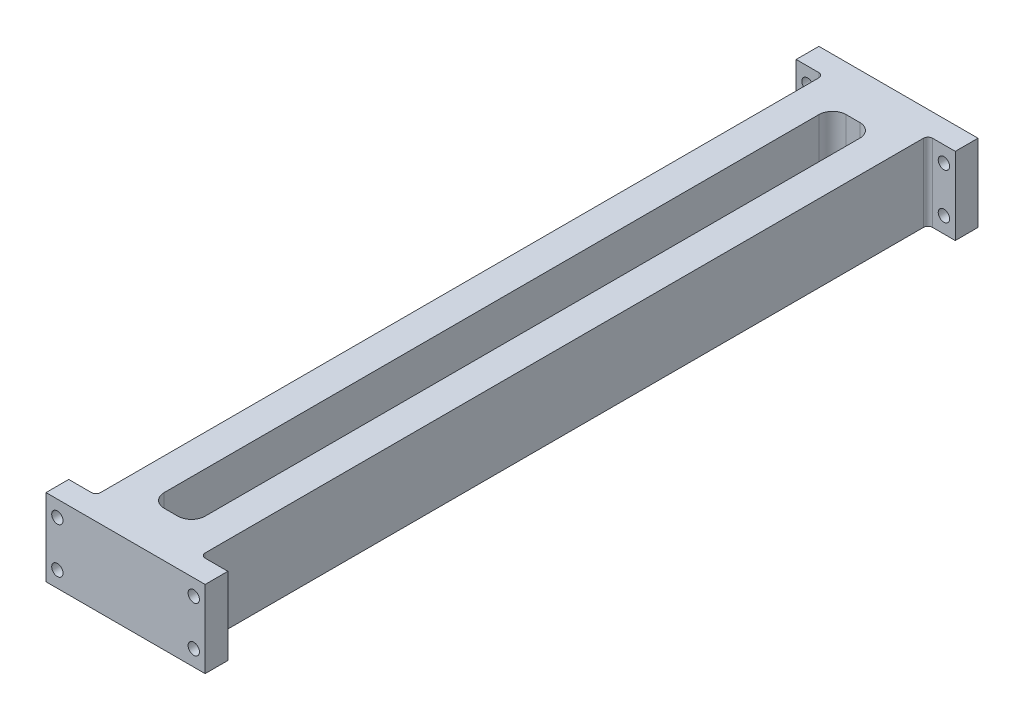
ISO-10303-21;
HEADER;
FILE_DESCRIPTION(('STEP AP214'),'2;1');
FILE_NAME('part.step','',(''),(''),'','','');
FILE_SCHEMA(('AUTOMOTIVE_DESIGN { 1 0 10303 214 1 1 1 1 }'));
ENDSEC;
DATA;
#1=APPLICATION_CONTEXT('core data for automotive mechanical design processes');
#2=APPLICATION_PROTOCOL_DEFINITION('international standard','automotive_design',2000,#1);
#3=PRODUCT_CONTEXT('',#1,'mechanical');
#4=PRODUCT('Part','Part','',(#3));
#5=PRODUCT_RELATED_PRODUCT_CATEGORY('part','',(#4));
#6=PRODUCT_DEFINITION_FORMATION('','',#4);
#7=PRODUCT_DEFINITION_CONTEXT('part definition',#1,'design');
#8=PRODUCT_DEFINITION('design','',#6,#7);
#9=PRODUCT_DEFINITION_SHAPE('','',#8);
#10=(LENGTH_UNIT() NAMED_UNIT(*) SI_UNIT(.MILLI.,.METRE.));
#11=(NAMED_UNIT(*) PLANE_ANGLE_UNIT() SI_UNIT($,.RADIAN.));
#12=(NAMED_UNIT(*) SI_UNIT($,.STERADIAN.) SOLID_ANGLE_UNIT());
#13=UNCERTAINTY_MEASURE_WITH_UNIT(LENGTH_MEASURE(1.E-05),#10,'distance_accuracy_value','');
#14=(GEOMETRIC_REPRESENTATION_CONTEXT(3) GLOBAL_UNCERTAINTY_ASSIGNED_CONTEXT((#13)) GLOBAL_UNIT_ASSIGNED_CONTEXT((#10,
#11,#12)) REPRESENTATION_CONTEXT('',''));
#15=CARTESIAN_POINT('',(0.,0.,0.));
#16=DIRECTION('',(0.,0.,1.));
#17=DIRECTION('',(1.,0.,0.));
#18=AXIS2_PLACEMENT_3D('',#15,#16,#17);
#19=CARTESIAN_POINT('',(-14.605,10.795,101.6));
#20=DIRECTION('',(1.,0.,0.));
#21=DIRECTION('',(0.,1.,0.));
#22=AXIS2_PLACEMENT_3D('',#19,#20,#21);
#23=PLANE('',#22);
#24=DIRECTION('',(0.,0.,-1.));
#25=VECTOR('',#24,1.);
#26=CARTESIAN_POINT('',(-14.605,10.795,101.6));
#27=LINE('',#26,#25);
#28=CARTESIAN_POINT('',(-14.605,10.795,100.33));
#29=VERTEX_POINT('',#28);
#30=CARTESIAN_POINT('',(-14.605,10.795,-100.33));
#31=VERTEX_POINT('',#30);
#32=EDGE_CURVE('E364',#29,#31,#27,.T.);
#33=ORIENTED_EDGE('',*,*,#32,.T.);
#34=DIRECTION('',(0.,-1.,0.));
#35=VECTOR('',#34,1.);
#36=CARTESIAN_POINT('',(-14.605,-10.795,-100.33));
#37=LINE('',#36,#35);
#38=CARTESIAN_POINT('',(-14.605,-10.795,-100.33));
#39=VERTEX_POINT('',#38);
#40=EDGE_CURVE('E393',#31,#39,#37,.T.);
#41=ORIENTED_EDGE('',*,*,#40,.T.);
#42=DIRECTION('',(0.,0.,-1.));
#43=VECTOR('',#42,1.);
#44=CARTESIAN_POINT('',(-14.605,-10.795,101.6));
#45=LINE('',#44,#43);
#46=CARTESIAN_POINT('',(-14.605,-10.795,100.33));
#47=VERTEX_POINT('',#46);
#48=EDGE_CURVE('E376',#47,#39,#45,.T.);
#49=ORIENTED_EDGE('',*,*,#48,.F.);
#50=DIRECTION('',(0.,-1.,0.));
#51=VECTOR('',#50,1.);
#52=CARTESIAN_POINT('',(-14.605,10.795,100.33));
#53=LINE('',#52,#51);
#54=EDGE_CURVE('E390',#47,#29,#53,.F.);
#55=ORIENTED_EDGE('',*,*,#54,.T.);
#56=EDGE_LOOP('',(#33,#41,#49,#55));
#57=FACE_BOUND('',#56,.T.);
#58=ADVANCED_FACE('F48',(#57),#23,.F.);
#59=CARTESIAN_POINT('',(-14.605,-10.795,101.6));
#60=DIRECTION('',(0.,1.,0.));
#61=DIRECTION('',(-1.,0.,0.));
#62=AXIS2_PLACEMENT_3D('',#59,#60,#61);
#63=PLANE('',#62);
#64=DIRECTION('',(1.,0.,0.));
#65=VECTOR('',#64,1.);
#66=CARTESIAN_POINT('',(-5.715,-10.795,95.25));
#67=LINE('',#66,#65);
#68=CARTESIAN_POINT('',(-1.905,-10.795,95.25));
#69=VERTEX_POINT('',#68);
#70=CARTESIAN_POINT('',(1.90500000000003,-10.795,95.25));
#71=VERTEX_POINT('',#70);
#72=EDGE_CURVE('E501',#69,#71,#67,.T.);
#73=ORIENTED_EDGE('',*,*,#72,.T.);
#74=CARTESIAN_POINT('',(1.90500000000003,-10.795,91.44));
#75=DIRECTION('',(0.,1.,0.));
#76=DIRECTION('',(-1.,0.,0.));
#77=AXIS2_PLACEMENT_3D('',#74,#75,#76);
#78=CIRCLE('',#77,3.81);
#79=CARTESIAN_POINT('',(5.71500000000003,-10.795,91.44));
#80=VERTEX_POINT('',#79);
#81=EDGE_CURVE('E462',#71,#80,#78,.T.);
#82=ORIENTED_EDGE('',*,*,#81,.T.);
#83=DIRECTION('',(0.,0.,-1.));
#84=VECTOR('',#83,1.);
#85=CARTESIAN_POINT('',(5.71500000000003,-10.795,-95.25));
#86=LINE('',#85,#84);
#87=CARTESIAN_POINT('',(5.71500000000003,-10.795,-91.44));
#88=VERTEX_POINT('',#87);
#89=EDGE_CURVE('E505',#80,#88,#86,.T.);
#90=ORIENTED_EDGE('',*,*,#89,.T.);
#91=CARTESIAN_POINT('',(1.90500000000003,-10.795,-91.44));
#92=DIRECTION('',(0.,1.,0.));
#93=DIRECTION('',(-1.,0.,0.));
#94=AXIS2_PLACEMENT_3D('',#91,#92,#93);
#95=CIRCLE('',#94,3.81);
#96=CARTESIAN_POINT('',(1.90500000000003,-10.795,-95.25));
#97=VERTEX_POINT('',#96);
#98=EDGE_CURVE('E74',#88,#97,#95,.T.);
#99=ORIENTED_EDGE('',*,*,#98,.T.);
#100=DIRECTION('',(-1.,0.,0.));
#101=VECTOR('',#100,1.);
#102=CARTESIAN_POINT('',(-5.715,-10.795,-95.25));
#103=LINE('',#102,#101);
#104=CARTESIAN_POINT('',(-1.905,-10.795,-95.25));
#105=VERTEX_POINT('',#104);
#106=EDGE_CURVE('E496',#97,#105,#103,.T.);
#107=ORIENTED_EDGE('',*,*,#106,.T.);
#108=CARTESIAN_POINT('',(-1.905,-10.795,-91.44));
#109=DIRECTION('',(0.,1.,0.));
#110=DIRECTION('',(-1.,0.,0.));
#111=AXIS2_PLACEMENT_3D('',#108,#109,#110);
#112=CIRCLE('',#111,3.81);
#113=CARTESIAN_POINT('',(-5.715,-10.795,-91.44));
#114=VERTEX_POINT('',#113);
#115=EDGE_CURVE('E11',#105,#114,#112,.T.);
#116=ORIENTED_EDGE('',*,*,#115,.T.);
#117=DIRECTION('',(0.,0.,1.));
#118=VECTOR('',#117,1.);
#119=CARTESIAN_POINT('',(-5.715,-10.795,95.25));
#120=LINE('',#119,#118);
#121=CARTESIAN_POINT('',(-5.715,-10.795,91.44));
#122=VERTEX_POINT('',#121);
#123=EDGE_CURVE('E494',#114,#122,#120,.T.);
#124=ORIENTED_EDGE('',*,*,#123,.T.);
#125=CARTESIAN_POINT('',(-1.905,-10.795,91.44));
#126=DIRECTION('',(0.,1.,0.));
#127=DIRECTION('',(-1.,0.,0.));
#128=AXIS2_PLACEMENT_3D('',#125,#126,#127);
#129=CIRCLE('',#128,3.81);
#130=EDGE_CURVE('E468',#122,#69,#129,.T.);
#131=ORIENTED_EDGE('',*,*,#130,.T.);
#132=EDGE_LOOP('',(#73,#82,#90,#99,#107,#116,#124,#131));
#133=FACE_BOUND('',#132,.T.);
#134=DIRECTION('',(1.,0.,0.));
#135=VECTOR('',#134,1.);
#136=CARTESIAN_POINT('',(-22.225,-10.795,101.6));
#137=LINE('',#136,#135);
#138=CARTESIAN_POINT('',(-22.225,-10.795,101.6));
#139=VERTEX_POINT('',#138);
#140=CARTESIAN_POINT('',(-15.875,-10.795,101.6));
#141=VERTEX_POINT('',#140);
#142=EDGE_CURVE('E339',#139,#141,#137,.T.);
#143=ORIENTED_EDGE('',*,*,#142,.T.);
#144=CARTESIAN_POINT('',(-15.875,-10.795,100.33));
#145=DIRECTION('',(0.,1.,0.));
#146=DIRECTION('',(-1.,0.,0.));
#147=AXIS2_PLACEMENT_3D('',#144,#145,#146);
#148=CIRCLE('',#147,1.27);
#149=EDGE_CURVE('E420',#141,#47,#148,.T.);
#150=ORIENTED_EDGE('',*,*,#149,.T.);
#151=ORIENTED_EDGE('',*,*,#48,.T.);
#152=CARTESIAN_POINT('',(-15.875,-10.795,-100.33));
#153=DIRECTION('',(0.,1.,0.));
#154=DIRECTION('',(-1.,0.,0.));
#155=AXIS2_PLACEMENT_3D('',#152,#153,#154);
#156=CIRCLE('',#155,1.27);
#157=CARTESIAN_POINT('',(-15.875,-10.795,-101.6));
#158=VERTEX_POINT('',#157);
#159=EDGE_CURVE('E414',#39,#158,#156,.T.);
#160=ORIENTED_EDGE('',*,*,#159,.T.);
#161=DIRECTION('',(1.,0.,0.));
#162=VECTOR('',#161,1.);
#163=CARTESIAN_POINT('',(-22.225,-10.795,-101.6));
#164=LINE('',#163,#162);
#165=CARTESIAN_POINT('',(-22.225,-10.795,-101.6));
#166=VERTEX_POINT('',#165);
#167=EDGE_CURVE('E249',#166,#158,#164,.T.);
#168=ORIENTED_EDGE('',*,*,#167,.F.);
#169=DIRECTION('',(0.,0.,1.));
#170=VECTOR('',#169,1.);
#171=CARTESIAN_POINT('',(-22.225,-10.795,-107.95));
#172=LINE('',#171,#170);
#173=CARTESIAN_POINT('',(-22.225,-10.795,-107.95));
#174=VERTEX_POINT('',#173);
#175=EDGE_CURVE('E263',#174,#166,#172,.T.);
#176=ORIENTED_EDGE('',*,*,#175,.F.);
#177=DIRECTION('',(1.,0.,0.));
#178=VECTOR('',#177,1.);
#179=CARTESIAN_POINT('',(-22.225,-10.795,-107.95));
#180=LINE('',#179,#178);
#181=CARTESIAN_POINT('',(22.225,-10.795,-107.95));
#182=VERTEX_POINT('',#181);
#183=EDGE_CURVE('E247',#174,#182,#180,.T.);
#184=ORIENTED_EDGE('',*,*,#183,.T.);
#185=DIRECTION('',(0.,0.,1.));
#186=VECTOR('',#185,1.);
#187=CARTESIAN_POINT('',(22.225,-10.795,-107.95));
#188=LINE('',#187,#186);
#189=CARTESIAN_POINT('',(22.225,-10.795,-101.6));
#190=VERTEX_POINT('',#189);
#191=EDGE_CURVE('E282',#182,#190,#188,.T.);
#192=ORIENTED_EDGE('',*,*,#191,.T.);
#193=CARTESIAN_POINT('',(15.875,-10.795,-101.6));
#194=VERTEX_POINT('',#193);
#195=EDGE_CURVE('E276',#194,#190,#164,.T.);
#196=ORIENTED_EDGE('',*,*,#195,.F.);
#197=CARTESIAN_POINT('',(15.875,-10.795,-100.33));
#198=DIRECTION('',(0.,1.,0.));
#199=DIRECTION('',(-1.,0.,0.));
#200=AXIS2_PLACEMENT_3D('',#197,#198,#199);
#201=CIRCLE('',#200,1.27);
#202=CARTESIAN_POINT('',(14.605,-10.795,-100.33));
#203=VERTEX_POINT('',#202);
#204=EDGE_CURVE('E411',#194,#203,#201,.T.);
#205=ORIENTED_EDGE('',*,*,#204,.T.);
#206=DIRECTION('',(0.,0.,-1.));
#207=VECTOR('',#206,1.);
#208=CARTESIAN_POINT('',(14.605,-10.795,101.6));
#209=LINE('',#208,#207);
#210=CARTESIAN_POINT('',(14.605,-10.795,100.33));
#211=VERTEX_POINT('',#210);
#212=EDGE_CURVE('E372',#211,#203,#209,.T.);
#213=ORIENTED_EDGE('',*,*,#212,.F.);
#214=CARTESIAN_POINT('',(15.875,-10.795,100.33));
#215=DIRECTION('',(0.,1.,0.));
#216=DIRECTION('',(-1.,0.,0.));
#217=AXIS2_PLACEMENT_3D('',#214,#215,#216);
#218=CIRCLE('',#217,1.27);
#219=CARTESIAN_POINT('',(15.875,-10.795,101.6));
#220=VERTEX_POINT('',#219);
#221=EDGE_CURVE('E429',#211,#220,#218,.T.);
#222=ORIENTED_EDGE('',*,*,#221,.T.);
#223=CARTESIAN_POINT('',(22.225,-10.795,101.6));
#224=VERTEX_POINT('',#223);
#225=EDGE_CURVE('E338',#220,#224,#137,.T.);
#226=ORIENTED_EDGE('',*,*,#225,.T.);
#227=DIRECTION('',(0.,0.,-1.));
#228=VECTOR('',#227,1.);
#229=CARTESIAN_POINT('',(22.225,-10.795,107.95));
#230=LINE('',#229,#228);
#231=CARTESIAN_POINT('',(22.225,-10.795,107.95));
#232=VERTEX_POINT('',#231);
#233=EDGE_CURVE('E356',#232,#224,#230,.T.);
#234=ORIENTED_EDGE('',*,*,#233,.F.);
#235=DIRECTION('',(1.,0.,0.));
#236=VECTOR('',#235,1.);
#237=CARTESIAN_POINT('',(-22.225,-10.795,107.95));
#238=LINE('',#237,#236);
#239=CARTESIAN_POINT('',(-22.225,-10.795,107.95));
#240=VERTEX_POINT('',#239);
#241=EDGE_CURVE('E324',#240,#232,#238,.T.);
#242=ORIENTED_EDGE('',*,*,#241,.F.);
#243=DIRECTION('',(0.,0.,-1.));
#244=VECTOR('',#243,1.);
#245=CARTESIAN_POINT('',(-22.225,-10.795,107.95));
#246=LINE('',#245,#244);
#247=EDGE_CURVE('E360',#240,#139,#246,.T.);
#248=ORIENTED_EDGE('',*,*,#247,.T.);
#249=EDGE_LOOP('',(#143,#150,#151,#160,#168,#176,#184,#192,#196,#205,#213,#222,#226,#234,#242,#248));
#250=FACE_BOUND('',#249,.T.);
#251=ADVANCED_FACE('F492',(#133,#250),#63,.F.);
#252=CARTESIAN_POINT('',(14.605,10.795,101.6));
#253=DIRECTION('',(-1.,0.,0.));
#254=DIRECTION('',(0.,-1.,0.));
#255=AXIS2_PLACEMENT_3D('',#252,#253,#254);
#256=PLANE('',#255);
#257=ORIENTED_EDGE('',*,*,#212,.T.);
#258=DIRECTION('',(0.,1.,0.));
#259=VECTOR('',#258,1.);
#260=CARTESIAN_POINT('',(14.605,10.795,-100.33));
#261=LINE('',#260,#259);
#262=CARTESIAN_POINT('',(14.605,10.795,-100.33));
#263=VERTEX_POINT('',#262);
#264=EDGE_CURVE('E383',#203,#263,#261,.T.);
#265=ORIENTED_EDGE('',*,*,#264,.T.);
#266=DIRECTION('',(0.,0.,-1.));
#267=VECTOR('',#266,1.);
#268=CARTESIAN_POINT('',(14.605,10.795,101.6));
#269=LINE('',#268,#267);
#270=CARTESIAN_POINT('',(14.605,10.795,100.33));
#271=VERTEX_POINT('',#270);
#272=EDGE_CURVE('E368',#271,#263,#269,.T.);
#273=ORIENTED_EDGE('',*,*,#272,.F.);
#274=DIRECTION('',(0.,1.,0.));
#275=VECTOR('',#274,1.);
#276=CARTESIAN_POINT('',(14.605,-10.795,100.33));
#277=LINE('',#276,#275);
#278=EDGE_CURVE('E380',#271,#211,#277,.F.);
#279=ORIENTED_EDGE('',*,*,#278,.T.);
#280=EDGE_LOOP('',(#257,#265,#273,#279));
#281=FACE_BOUND('',#280,.T.);
#282=ADVANCED_FACE('F586',(#281),#256,.F.);
#283=CARTESIAN_POINT('',(14.605,10.795,101.6));
#284=DIRECTION('',(0.,-1.,0.));
#285=DIRECTION('',(1.,0.,0.));
#286=AXIS2_PLACEMENT_3D('',#283,#284,#285);
#287=PLANE('',#286);
#288=DIRECTION('',(0.,0.,1.));
#289=VECTOR('',#288,1.);
#290=CARTESIAN_POINT('',(-5.715,10.795,95.25));
#291=LINE('',#290,#289);
#292=CARTESIAN_POINT('',(-5.715,10.795,-91.44));
#293=VERTEX_POINT('',#292);
#294=CARTESIAN_POINT('',(-5.715,10.795,91.44));
#295=VERTEX_POINT('',#294);
#296=EDGE_CURVE('E481',#293,#295,#291,.T.);
#297=ORIENTED_EDGE('',*,*,#296,.F.);
#298=CARTESIAN_POINT('',(-1.905,10.795,-91.44));
#299=DIRECTION('',(0.,-1.,0.));
#300=DIRECTION('',(1.,0.,0.));
#301=AXIS2_PLACEMENT_3D('',#298,#299,#300);
#302=CIRCLE('',#301,3.81);
#303=CARTESIAN_POINT('',(-1.905,10.795,-95.25));
#304=VERTEX_POINT('',#303);
#305=EDGE_CURVE('E57',#293,#304,#302,.T.);
#306=ORIENTED_EDGE('',*,*,#305,.T.);
#307=DIRECTION('',(-1.,0.,0.));
#308=VECTOR('',#307,1.);
#309=CARTESIAN_POINT('',(-5.715,10.795,-95.25));
#310=LINE('',#309,#308);
#311=CARTESIAN_POINT('',(1.90500000000003,10.795,-95.25));
#312=VERTEX_POINT('',#311);
#313=EDGE_CURVE('E479',#312,#304,#310,.T.);
#314=ORIENTED_EDGE('',*,*,#313,.F.);
#315=CARTESIAN_POINT('',(1.90500000000003,10.795,-91.44));
#316=DIRECTION('',(0.,-1.,0.));
#317=DIRECTION('',(1.,0.,0.));
#318=AXIS2_PLACEMENT_3D('',#315,#316,#317);
#319=CIRCLE('',#318,3.81);
#320=CARTESIAN_POINT('',(5.71500000000003,10.795,-91.44));
#321=VERTEX_POINT('',#320);
#322=EDGE_CURVE('E471',#312,#321,#319,.T.);
#323=ORIENTED_EDGE('',*,*,#322,.T.);
#324=DIRECTION('',(0.,0.,-1.));
#325=VECTOR('',#324,1.);
#326=CARTESIAN_POINT('',(5.71500000000003,10.795,-95.25));
#327=LINE('',#326,#325);
#328=CARTESIAN_POINT('',(5.71500000000003,10.795,91.44));
#329=VERTEX_POINT('',#328);
#330=EDGE_CURVE('E507',#329,#321,#327,.T.);
#331=ORIENTED_EDGE('',*,*,#330,.F.);
#332=CARTESIAN_POINT('',(1.90500000000003,10.795,91.44));
#333=DIRECTION('',(0.,-1.,0.));
#334=DIRECTION('',(1.,0.,0.));
#335=AXIS2_PLACEMENT_3D('',#332,#333,#334);
#336=CIRCLE('',#335,3.81);
#337=CARTESIAN_POINT('',(1.90500000000003,10.795,95.25));
#338=VERTEX_POINT('',#337);
#339=EDGE_CURVE('E459',#329,#338,#336,.T.);
#340=ORIENTED_EDGE('',*,*,#339,.T.);
#341=DIRECTION('',(1.,0.,0.));
#342=VECTOR('',#341,1.);
#343=CARTESIAN_POINT('',(-5.715,10.795,95.25));
#344=LINE('',#343,#342);
#345=CARTESIAN_POINT('',(-1.905,10.795,95.25));
#346=VERTEX_POINT('',#345);
#347=EDGE_CURVE('E515',#346,#338,#344,.T.);
#348=ORIENTED_EDGE('',*,*,#347,.F.);
#349=CARTESIAN_POINT('',(-1.905,10.795,91.44));
#350=DIRECTION('',(0.,-1.,0.));
#351=DIRECTION('',(1.,0.,0.));
#352=AXIS2_PLACEMENT_3D('',#349,#350,#351);
#353=CIRCLE('',#352,3.81);
#354=EDGE_CURVE('E465',#346,#295,#353,.T.);
#355=ORIENTED_EDGE('',*,*,#354,.T.);
#356=EDGE_LOOP('',(#297,#306,#314,#323,#331,#340,#348,#355));
#357=FACE_BOUND('',#356,.T.);
#358=DIRECTION('',(-1.,0.,0.));
#359=VECTOR('',#358,1.);
#360=CARTESIAN_POINT('',(-22.225,10.795,101.6));
#361=LINE('',#360,#359);
#362=CARTESIAN_POINT('',(22.225,10.795,101.6));
#363=VERTEX_POINT('',#362);
#364=CARTESIAN_POINT('',(15.875,10.795,101.6));
#365=VERTEX_POINT('',#364);
#366=EDGE_CURVE('E325',#363,#365,#361,.T.);
#367=ORIENTED_EDGE('',*,*,#366,.T.);
#368=CARTESIAN_POINT('',(15.875,10.795,100.33));
#369=DIRECTION('',(0.,-1.,0.));
#370=DIRECTION('',(1.,0.,0.));
#371=AXIS2_PLACEMENT_3D('',#368,#369,#370);
#372=CIRCLE('',#371,1.27);
#373=EDGE_CURVE('E426',#365,#271,#372,.T.);
#374=ORIENTED_EDGE('',*,*,#373,.T.);
#375=ORIENTED_EDGE('',*,*,#272,.T.);
#376=CARTESIAN_POINT('',(15.875,10.795,-100.33));
#377=DIRECTION('',(0.,-1.,0.));
#378=DIRECTION('',(1.,0.,0.));
#379=AXIS2_PLACEMENT_3D('',#376,#377,#378);
#380=CIRCLE('',#379,1.27);
#381=CARTESIAN_POINT('',(15.875,10.795,-101.6));
#382=VERTEX_POINT('',#381);
#383=EDGE_CURVE('E408',#263,#382,#380,.T.);
#384=ORIENTED_EDGE('',*,*,#383,.T.);
#385=DIRECTION('',(-1.,0.,0.));
#386=VECTOR('',#385,1.);
#387=CARTESIAN_POINT('',(-22.225,10.795,-101.6));
#388=LINE('',#387,#386);
#389=CARTESIAN_POINT('',(22.225,10.795,-101.6));
#390=VERTEX_POINT('',#389);
#391=EDGE_CURVE('E268',#390,#382,#388,.T.);
#392=ORIENTED_EDGE('',*,*,#391,.F.);
#393=DIRECTION('',(0.,0.,1.));
#394=VECTOR('',#393,1.);
#395=CARTESIAN_POINT('',(22.225,10.795,-107.95));
#396=LINE('',#395,#394);
#397=CARTESIAN_POINT('',(22.225,10.795,-107.95));
#398=VERTEX_POINT('',#397);
#399=EDGE_CURVE('E238',#398,#390,#396,.T.);
#400=ORIENTED_EDGE('',*,*,#399,.F.);
#401=DIRECTION('',(-1.,0.,0.));
#402=VECTOR('',#401,1.);
#403=CARTESIAN_POINT('',(-22.225,10.795,-107.95));
#404=LINE('',#403,#402);
#405=CARTESIAN_POINT('',(-22.225,10.795,-107.95));
#406=VERTEX_POINT('',#405);
#407=EDGE_CURVE('E244',#398,#406,#404,.T.);
#408=ORIENTED_EDGE('',*,*,#407,.T.);
#409=DIRECTION('',(0.,0.,1.));
#410=VECTOR('',#409,1.);
#411=CARTESIAN_POINT('',(-22.225,10.795,-107.95));
#412=LINE('',#411,#410);
#413=CARTESIAN_POINT('',(-22.225,10.795,-101.6));
#414=VERTEX_POINT('',#413);
#415=EDGE_CURVE('E226',#406,#414,#412,.T.);
#416=ORIENTED_EDGE('',*,*,#415,.T.);
#417=CARTESIAN_POINT('',(-15.875,10.795,-101.6));
#418=VERTEX_POINT('',#417);
#419=EDGE_CURVE('E266',#418,#414,#388,.T.);
#420=ORIENTED_EDGE('',*,*,#419,.F.);
#421=CARTESIAN_POINT('',(-15.875,10.795,-100.33));
#422=DIRECTION('',(0.,-1.,0.));
#423=DIRECTION('',(1.,0.,0.));
#424=AXIS2_PLACEMENT_3D('',#421,#422,#423);
#425=CIRCLE('',#424,1.27);
#426=EDGE_CURVE('E417',#418,#31,#425,.T.);
#427=ORIENTED_EDGE('',*,*,#426,.T.);
#428=ORIENTED_EDGE('',*,*,#32,.F.);
#429=CARTESIAN_POINT('',(-15.875,10.795,100.33));
#430=DIRECTION('',(0.,-1.,0.));
#431=DIRECTION('',(1.,0.,0.));
#432=AXIS2_PLACEMENT_3D('',#429,#430,#431);
#433=CIRCLE('',#432,1.27);
#434=CARTESIAN_POINT('',(-15.875,10.795,101.6));
#435=VERTEX_POINT('',#434);
#436=EDGE_CURVE('E423',#29,#435,#433,.T.);
#437=ORIENTED_EDGE('',*,*,#436,.T.);
#438=CARTESIAN_POINT('',(-22.225,10.795,101.6));
#439=VERTEX_POINT('',#438);
#440=EDGE_CURVE('E346',#435,#439,#361,.T.);
#441=ORIENTED_EDGE('',*,*,#440,.T.);
#442=DIRECTION('',(0.,0.,-1.));
#443=VECTOR('',#442,1.);
#444=CARTESIAN_POINT('',(-22.225,10.795,107.95));
#445=LINE('',#444,#443);
#446=CARTESIAN_POINT('',(-22.225,10.795,107.95));
#447=VERTEX_POINT('',#446);
#448=EDGE_CURVE('E334',#447,#439,#445,.T.);
#449=ORIENTED_EDGE('',*,*,#448,.F.);
#450=DIRECTION('',(-1.,0.,0.));
#451=VECTOR('',#450,1.);
#452=CARTESIAN_POINT('',(-22.225,10.795,107.95));
#453=LINE('',#452,#451);
#454=CARTESIAN_POINT('',(22.225,10.795,107.95));
#455=VERTEX_POINT('',#454);
#456=EDGE_CURVE('E331',#455,#447,#453,.T.);
#457=ORIENTED_EDGE('',*,*,#456,.F.);
#458=DIRECTION('',(0.,0.,-1.));
#459=VECTOR('',#458,1.);
#460=CARTESIAN_POINT('',(22.225,10.795,107.95));
#461=LINE('',#460,#459);
#462=EDGE_CURVE('E352',#455,#363,#461,.T.);
#463=ORIENTED_EDGE('',*,*,#462,.T.);
#464=EDGE_LOOP('',(#367,#374,#375,#384,#392,#400,#408,#416,#420,#427,#428,#437,#441,#449,#457,#463));
#465=FACE_BOUND('',#464,.T.);
#466=ADVANCED_FACE('F252',(#357,#465),#287,.F.);
#467=CARTESIAN_POINT('',(0.,0.,101.6));
#468=DIRECTION('',(0.,0.,1.));
#469=DIRECTION('',(1.,0.,0.));
#470=AXIS2_PLACEMENT_3D('',#467,#468,#469);
#471=PLANE('',#470);
#472=CARTESIAN_POINT('',(-19.05,6.35,101.6));
#473=DIRECTION('',(0.,0.,1.));
#474=DIRECTION('',(1.,0.,0.));
#475=AXIS2_PLACEMENT_3D('',#472,#473,#474);
#476=CIRCLE('',#475,1.5875);
#477=CARTESIAN_POINT('',(-17.4625,6.35,101.6));
#478=VERTEX_POINT('',#477);
#479=EDGE_CURVE('E308',#478,#478,#476,.T.);
#480=ORIENTED_EDGE('',*,*,#479,.T.);
#481=EDGE_LOOP('',(#480));
#482=FACE_BOUND('',#481,.T.);
#483=CARTESIAN_POINT('',(-19.05,-6.35,101.6));
#484=DIRECTION('',(0.,0.,1.));
#485=DIRECTION('',(-1.,0.,0.));
#486=AXIS2_PLACEMENT_3D('',#483,#484,#485);
#487=CIRCLE('',#486,1.5875);
#488=CARTESIAN_POINT('',(-20.6375,-6.35,101.6));
#489=VERTEX_POINT('',#488);
#490=EDGE_CURVE('E300',#489,#489,#487,.T.);
#491=ORIENTED_EDGE('',*,*,#490,.T.);
#492=EDGE_LOOP('',(#491));
#493=FACE_BOUND('',#492,.T.);
#494=ORIENTED_EDGE('',*,*,#440,.F.);
#495=DIRECTION('',(0.,-1.,0.));
#496=VECTOR('',#495,1.);
#497=CARTESIAN_POINT('',(-15.875,-10.795,101.6));
#498=LINE('',#497,#496);
#499=EDGE_CURVE('E400',#435,#141,#498,.T.);
#500=ORIENTED_EDGE('',*,*,#499,.T.);
#501=ORIENTED_EDGE('',*,*,#142,.F.);
#502=DIRECTION('',(0.,-1.,0.));
#503=VECTOR('',#502,1.);
#504=CARTESIAN_POINT('',(-22.225,10.795,101.6));
#505=LINE('',#504,#503);
#506=EDGE_CURVE('E316',#439,#139,#505,.T.);
#507=ORIENTED_EDGE('',*,*,#506,.F.);
#508=EDGE_LOOP('',(#494,#500,#501,#507));
#509=FACE_BOUND('',#508,.T.);
#510=ADVANCED_FACE('F689',(#482,#493,#509),#471,.F.);
#511=CARTESIAN_POINT('',(19.05,6.35,101.6));
#512=DIRECTION('',(0.,0.,1.));
#513=DIRECTION('',(-1.,0.,0.));
#514=AXIS2_PLACEMENT_3D('',#511,#512,#513);
#515=CIRCLE('',#514,1.5875);
#516=CARTESIAN_POINT('',(17.4625,6.35,101.6));
#517=VERTEX_POINT('',#516);
#518=EDGE_CURVE('E237',#517,#517,#515,.T.);
#519=ORIENTED_EDGE('',*,*,#518,.T.);
#520=EDGE_LOOP('',(#519));
#521=FACE_BOUND('',#520,.T.);
#522=CARTESIAN_POINT('',(19.05,-6.35,101.6));
#523=DIRECTION('',(0.,0.,1.));
#524=DIRECTION('',(1.,0.,0.));
#525=AXIS2_PLACEMENT_3D('',#522,#523,#524);
#526=CIRCLE('',#525,1.5875);
#527=CARTESIAN_POINT('',(20.6375,-6.35,101.6));
#528=VERTEX_POINT('',#527);
#529=EDGE_CURVE('E292',#528,#528,#526,.T.);
#530=ORIENTED_EDGE('',*,*,#529,.T.);
#531=EDGE_LOOP('',(#530));
#532=FACE_BOUND('',#531,.T.);
#533=ORIENTED_EDGE('',*,*,#225,.F.);
#534=DIRECTION('',(0.,1.,0.));
#535=VECTOR('',#534,1.);
#536=CARTESIAN_POINT('',(15.875,10.795,101.6));
#537=LINE('',#536,#535);
#538=EDGE_CURVE('E404',#220,#365,#537,.T.);
#539=ORIENTED_EDGE('',*,*,#538,.T.);
#540=ORIENTED_EDGE('',*,*,#366,.F.);
#541=DIRECTION('',(0.,1.,0.));
#542=VECTOR('',#541,1.);
#543=CARTESIAN_POINT('',(22.225,10.795,101.6));
#544=LINE('',#543,#542);
#545=EDGE_CURVE('E343',#224,#363,#544,.T.);
#546=ORIENTED_EDGE('',*,*,#545,.F.);
#547=EDGE_LOOP('',(#533,#539,#540,#546));
#548=FACE_BOUND('',#547,.T.);
#549=ADVANCED_FACE('F687',(#521,#532,#548),#471,.F.);
#550=CARTESIAN_POINT('',(0.,0.,107.95));
#551=DIRECTION('',(0.,0.,1.));
#552=DIRECTION('',(1.,0.,0.));
#553=AXIS2_PLACEMENT_3D('',#550,#551,#552);
#554=PLANE('',#553);
#555=CARTESIAN_POINT('',(19.05,-6.35,107.95));
#556=DIRECTION('',(0.,0.,1.));
#557=DIRECTION('',(1.,0.,0.));
#558=AXIS2_PLACEMENT_3D('',#555,#556,#557);
#559=CIRCLE('',#558,1.5875);
#560=CARTESIAN_POINT('',(20.6375,-6.35,107.95));
#561=VERTEX_POINT('',#560);
#562=EDGE_CURVE('E296',#561,#561,#559,.T.);
#563=ORIENTED_EDGE('',*,*,#562,.F.);
#564=EDGE_LOOP('',(#563));
#565=FACE_BOUND('',#564,.T.);
#566=CARTESIAN_POINT('',(-19.05,6.35,107.95));
#567=DIRECTION('',(0.,0.,1.));
#568=DIRECTION('',(1.,0.,0.));
#569=AXIS2_PLACEMENT_3D('',#566,#567,#568);
#570=CIRCLE('',#569,1.5875);
#571=CARTESIAN_POINT('',(-17.4625,6.35,107.95));
#572=VERTEX_POINT('',#571);
#573=EDGE_CURVE('E312',#572,#572,#570,.T.);
#574=ORIENTED_EDGE('',*,*,#573,.F.);
#575=EDGE_LOOP('',(#574));
#576=FACE_BOUND('',#575,.T.);
#577=DIRECTION('',(0.,-1.,0.));
#578=VECTOR('',#577,1.);
#579=CARTESIAN_POINT('',(-22.225,10.795,107.95));
#580=LINE('',#579,#578);
#581=EDGE_CURVE('E320',#447,#240,#580,.T.);
#582=ORIENTED_EDGE('',*,*,#581,.T.);
#583=ORIENTED_EDGE('',*,*,#241,.T.);
#584=DIRECTION('',(0.,1.,0.));
#585=VECTOR('',#584,1.);
#586=CARTESIAN_POINT('',(22.225,10.795,107.95));
#587=LINE('',#586,#585);
#588=EDGE_CURVE('E328',#232,#455,#587,.T.);
#589=ORIENTED_EDGE('',*,*,#588,.T.);
#590=ORIENTED_EDGE('',*,*,#456,.T.);
#591=EDGE_LOOP('',(#582,#583,#589,#590));
#592=FACE_BOUND('',#591,.T.);
#593=CARTESIAN_POINT('',(-19.05,-6.35,107.95));
#594=DIRECTION('',(0.,0.,1.));
#595=DIRECTION('',(-1.,0.,0.));
#596=AXIS2_PLACEMENT_3D('',#593,#594,#595);
#597=CIRCLE('',#596,1.5875);
#598=CARTESIAN_POINT('',(-20.6375,-6.35,107.95));
#599=VERTEX_POINT('',#598);
#600=EDGE_CURVE('E304',#599,#599,#597,.T.);
#601=ORIENTED_EDGE('',*,*,#600,.F.);
#602=EDGE_LOOP('',(#601));
#603=FACE_BOUND('',#602,.T.);
#604=CARTESIAN_POINT('',(19.05,6.35,107.95));
#605=DIRECTION('',(0.,0.,1.));
#606=DIRECTION('',(-1.,0.,0.));
#607=AXIS2_PLACEMENT_3D('',#604,#605,#606);
#608=CIRCLE('',#607,1.5875);
#609=CARTESIAN_POINT('',(17.4625,6.35,107.95));
#610=VERTEX_POINT('',#609);
#611=EDGE_CURVE('E288',#610,#610,#608,.T.);
#612=ORIENTED_EDGE('',*,*,#611,.F.);
#613=EDGE_LOOP('',(#612));
#614=FACE_BOUND('',#613,.T.);
#615=ADVANCED_FACE('F683',(#565,#576,#592,#603,#614),#554,.T.);
#616=CARTESIAN_POINT('',(-22.225,10.795,107.95));
#617=DIRECTION('',(1.,0.,0.));
#618=DIRECTION('',(0.,1.,0.));
#619=AXIS2_PLACEMENT_3D('',#616,#617,#618);
#620=PLANE('',#619);
#621=ORIENTED_EDGE('',*,*,#506,.T.);
#622=ORIENTED_EDGE('',*,*,#247,.F.);
#623=ORIENTED_EDGE('',*,*,#581,.F.);
#624=ORIENTED_EDGE('',*,*,#448,.T.);
#625=EDGE_LOOP('',(#621,#622,#623,#624));
#626=FACE_BOUND('',#625,.T.);
#627=ADVANCED_FACE('F686',(#626),#620,.F.);
#628=CARTESIAN_POINT('',(22.225,10.795,107.95));
#629=DIRECTION('',(-1.,0.,0.));
#630=DIRECTION('',(0.,0.,1.));
#631=AXIS2_PLACEMENT_3D('',#628,#629,#630);
#632=PLANE('',#631);
#633=ORIENTED_EDGE('',*,*,#545,.T.);
#634=ORIENTED_EDGE('',*,*,#462,.F.);
#635=ORIENTED_EDGE('',*,*,#588,.F.);
#636=ORIENTED_EDGE('',*,*,#233,.T.);
#637=EDGE_LOOP('',(#633,#634,#635,#636));
#638=FACE_BOUND('',#637,.T.);
#639=ADVANCED_FACE('F681',(#638),#632,.F.);
#640=CARTESIAN_POINT('',(-19.05,6.35,107.95));
#641=DIRECTION('',(0.,0.,-1.));
#642=DIRECTION('',(-1.,0.,0.));
#643=AXIS2_PLACEMENT_3D('',#640,#641,#642);
#644=CYLINDRICAL_SURFACE('',#643,1.5875);
#645=ORIENTED_EDGE('',*,*,#573,.T.);
#646=EDGE_LOOP('',(#645));
#647=FACE_BOUND('',#646,.T.);
#648=ORIENTED_EDGE('',*,*,#479,.F.);
#649=EDGE_LOOP('',(#648));
#650=FACE_BOUND('',#649,.T.);
#651=ADVANCED_FACE('F677',(#647,#650),#644,.F.);
#652=CARTESIAN_POINT('',(-19.05,-6.35,107.95));
#653=DIRECTION('',(0.,0.,-1.));
#654=DIRECTION('',(-1.,0.,0.));
#655=AXIS2_PLACEMENT_3D('',#652,#653,#654);
#656=CYLINDRICAL_SURFACE('',#655,1.5875);
#657=ORIENTED_EDGE('',*,*,#600,.T.);
#658=EDGE_LOOP('',(#657));
#659=FACE_BOUND('',#658,.T.);
#660=ORIENTED_EDGE('',*,*,#490,.F.);
#661=EDGE_LOOP('',(#660));
#662=FACE_BOUND('',#661,.T.);
#663=ADVANCED_FACE('F673',(#659,#662),#656,.F.);
#664=CARTESIAN_POINT('',(19.05,-6.35,107.95));
#665=DIRECTION('',(0.,0.,-1.));
#666=DIRECTION('',(-1.,0.,0.));
#667=AXIS2_PLACEMENT_3D('',#664,#665,#666);
#668=CYLINDRICAL_SURFACE('',#667,1.5875);
#669=ORIENTED_EDGE('',*,*,#562,.T.);
#670=EDGE_LOOP('',(#669));
#671=FACE_BOUND('',#670,.T.);
#672=ORIENTED_EDGE('',*,*,#529,.F.);
#673=EDGE_LOOP('',(#672));
#674=FACE_BOUND('',#673,.T.);
#675=ADVANCED_FACE('F669',(#671,#674),#668,.F.);
#676=CARTESIAN_POINT('',(19.05,6.35,107.95));
#677=DIRECTION('',(0.,0.,-1.));
#678=DIRECTION('',(-1.,0.,0.));
#679=AXIS2_PLACEMENT_3D('',#676,#677,#678);
#680=CYLINDRICAL_SURFACE('',#679,1.5875);
#681=ORIENTED_EDGE('',*,*,#611,.T.);
#682=EDGE_LOOP('',(#681));
#683=FACE_BOUND('',#682,.T.);
#684=ORIENTED_EDGE('',*,*,#518,.F.);
#685=EDGE_LOOP('',(#684));
#686=FACE_BOUND('',#685,.T.);
#687=ADVANCED_FACE('F557',(#683,#686),#680,.F.);
#688=CARTESIAN_POINT('',(0.,0.,-101.6));
#689=DIRECTION('',(0.,0.,-1.));
#690=DIRECTION('',(1.,0.,0.));
#691=AXIS2_PLACEMENT_3D('',#688,#689,#690);
#692=PLANE('',#691);
#693=ORIENTED_EDGE('',*,*,#167,.T.);
#694=DIRECTION('',(0.,-1.,0.));
#695=VECTOR('',#694,1.);
#696=CARTESIAN_POINT('',(-15.875,10.795,-101.6));
#697=LINE('',#696,#695);
#698=EDGE_CURVE('E397',#158,#418,#697,.F.);
#699=ORIENTED_EDGE('',*,*,#698,.T.);
#700=ORIENTED_EDGE('',*,*,#419,.T.);
#701=DIRECTION('',(0.,-1.,0.));
#702=VECTOR('',#701,1.);
#703=CARTESIAN_POINT('',(-22.225,10.795,-101.6));
#704=LINE('',#703,#702);
#705=EDGE_CURVE('E232',#414,#166,#704,.T.);
#706=ORIENTED_EDGE('',*,*,#705,.T.);
#707=EDGE_LOOP('',(#693,#699,#700,#706));
#708=FACE_BOUND('',#707,.T.);
#709=CARTESIAN_POINT('',(-19.05,6.35,-101.6));
#710=DIRECTION('',(0.,0.,1.));
#711=DIRECTION('',(1.,0.,0.));
#712=AXIS2_PLACEMENT_3D('',#709,#710,#711);
#713=CIRCLE('',#712,1.5875);
#714=CARTESIAN_POINT('',(-17.4625,6.35,-101.6));
#715=VERTEX_POINT('',#714);
#716=EDGE_CURVE('E542',#715,#715,#713,.T.);
#717=ORIENTED_EDGE('',*,*,#716,.F.);
#718=EDGE_LOOP('',(#717));
#719=FACE_BOUND('',#718,.T.);
#720=CARTESIAN_POINT('',(-19.05,-6.35,-101.6));
#721=DIRECTION('',(0.,0.,1.));
#722=DIRECTION('',(-1.,0.,0.));
#723=AXIS2_PLACEMENT_3D('',#720,#721,#722);
#724=CIRCLE('',#723,1.5875);
#725=CARTESIAN_POINT('',(-20.6375,-6.35,-101.6));
#726=VERTEX_POINT('',#725);
#727=EDGE_CURVE('E534',#726,#726,#724,.T.);
#728=ORIENTED_EDGE('',*,*,#727,.F.);
#729=EDGE_LOOP('',(#728));
#730=FACE_BOUND('',#729,.T.);
#731=ADVANCED_FACE('F554',(#708,#719,#730),#692,.F.);
#732=CARTESIAN_POINT('',(-22.225,10.795,-107.95));
#733=DIRECTION('',(-1.,0.,0.));
#734=DIRECTION('',(0.,-1.,0.));
#735=AXIS2_PLACEMENT_3D('',#732,#733,#734);
#736=PLANE('',#735);
#737=ORIENTED_EDGE('',*,*,#705,.F.);
#738=ORIENTED_EDGE('',*,*,#415,.F.);
#739=DIRECTION('',(0.,-1.,0.));
#740=VECTOR('',#739,1.);
#741=CARTESIAN_POINT('',(-22.225,10.795,-107.95));
#742=LINE('',#741,#740);
#743=EDGE_CURVE('E229',#406,#174,#742,.T.);
#744=ORIENTED_EDGE('',*,*,#743,.T.);
#745=ORIENTED_EDGE('',*,*,#175,.T.);
#746=EDGE_LOOP('',(#737,#738,#744,#745));
#747=FACE_BOUND('',#746,.T.);
#748=ADVANCED_FACE('F228',(#747),#736,.T.);
#749=CARTESIAN_POINT('',(22.225,10.795,-107.95));
#750=DIRECTION('',(1.,0.,0.));
#751=DIRECTION('',(0.,0.,-1.));
#752=AXIS2_PLACEMENT_3D('',#749,#750,#751);
#753=PLANE('',#752);
#754=DIRECTION('',(0.,1.,0.));
#755=VECTOR('',#754,1.);
#756=CARTESIAN_POINT('',(22.225,10.795,-101.6));
#757=LINE('',#756,#755);
#758=EDGE_CURVE('E272',#190,#390,#757,.T.);
#759=ORIENTED_EDGE('',*,*,#758,.F.);
#760=ORIENTED_EDGE('',*,*,#191,.F.);
#761=DIRECTION('',(0.,1.,0.));
#762=VECTOR('',#761,1.);
#763=CARTESIAN_POINT('',(22.225,10.795,-107.95));
#764=LINE('',#763,#762);
#765=EDGE_CURVE('E255',#182,#398,#764,.T.);
#766=ORIENTED_EDGE('',*,*,#765,.T.);
#767=ORIENTED_EDGE('',*,*,#399,.T.);
#768=EDGE_LOOP('',(#759,#760,#766,#767));
#769=FACE_BOUND('',#768,.T.);
#770=ADVANCED_FACE('F658',(#769),#753,.T.);
#771=CARTESIAN_POINT('',(0.,0.,-107.95));
#772=DIRECTION('',(0.,0.,-1.));
#773=DIRECTION('',(1.,0.,0.));
#774=AXIS2_PLACEMENT_3D('',#771,#772,#773);
#775=PLANE('',#774);
#776=CARTESIAN_POINT('',(19.05,6.35,-107.95));
#777=DIRECTION('',(0.,0.,1.));
#778=DIRECTION('',(-1.,0.,0.));
#779=AXIS2_PLACEMENT_3D('',#776,#777,#778);
#780=CIRCLE('',#779,1.5875);
#781=CARTESIAN_POINT('',(17.4625,6.35,-107.95));
#782=VERTEX_POINT('',#781);
#783=EDGE_CURVE('E522',#782,#782,#780,.T.);
#784=ORIENTED_EDGE('',*,*,#783,.T.);
#785=EDGE_LOOP('',(#784));
#786=FACE_BOUND('',#785,.T.);
#787=CARTESIAN_POINT('',(19.05,-6.35,-107.95));
#788=DIRECTION('',(0.,0.,1.));
#789=DIRECTION('',(1.,0.,0.));
#790=AXIS2_PLACEMENT_3D('',#787,#788,#789);
#791=CIRCLE('',#790,1.5875);
#792=CARTESIAN_POINT('',(20.6375,-6.35,-107.95));
#793=VERTEX_POINT('',#792);
#794=EDGE_CURVE('E530',#793,#793,#791,.T.);
#795=ORIENTED_EDGE('',*,*,#794,.T.);
#796=EDGE_LOOP('',(#795));
#797=FACE_BOUND('',#796,.T.);
#798=CARTESIAN_POINT('',(-19.05,-6.35,-107.95));
#799=DIRECTION('',(0.,0.,1.));
#800=DIRECTION('',(-1.,0.,0.));
#801=AXIS2_PLACEMENT_3D('',#798,#799,#800);
#802=CIRCLE('',#801,1.5875);
#803=CARTESIAN_POINT('',(-20.6375,-6.35,-107.95));
#804=VERTEX_POINT('',#803);
#805=EDGE_CURVE('E538',#804,#804,#802,.T.);
#806=ORIENTED_EDGE('',*,*,#805,.T.);
#807=EDGE_LOOP('',(#806));
#808=FACE_BOUND('',#807,.T.);
#809=CARTESIAN_POINT('',(-19.05,6.35,-107.95));
#810=DIRECTION('',(0.,0.,1.));
#811=DIRECTION('',(1.,0.,0.));
#812=AXIS2_PLACEMENT_3D('',#809,#810,#811);
#813=CIRCLE('',#812,1.5875);
#814=CARTESIAN_POINT('',(-17.4625,6.35,-107.95));
#815=VERTEX_POINT('',#814);
#816=EDGE_CURVE('E267',#815,#815,#813,.T.);
#817=ORIENTED_EDGE('',*,*,#816,.T.);
#818=EDGE_LOOP('',(#817));
#819=FACE_BOUND('',#818,.T.);
#820=ORIENTED_EDGE('',*,*,#743,.F.);
#821=ORIENTED_EDGE('',*,*,#407,.F.);
#822=ORIENTED_EDGE('',*,*,#765,.F.);
#823=ORIENTED_EDGE('',*,*,#183,.F.);
#824=EDGE_LOOP('',(#820,#821,#822,#823));
#825=FACE_BOUND('',#824,.T.);
#826=ADVANCED_FACE('F242',(#786,#797,#808,#819,#825),#775,.T.);
#827=ORIENTED_EDGE('',*,*,#391,.T.);
#828=DIRECTION('',(0.,1.,0.));
#829=VECTOR('',#828,1.);
#830=CARTESIAN_POINT('',(15.875,-10.795,-101.6));
#831=LINE('',#830,#829);
#832=EDGE_CURVE('E387',#382,#194,#831,.F.);
#833=ORIENTED_EDGE('',*,*,#832,.T.);
#834=ORIENTED_EDGE('',*,*,#195,.T.);
#835=ORIENTED_EDGE('',*,*,#758,.T.);
#836=EDGE_LOOP('',(#827,#833,#834,#835));
#837=FACE_BOUND('',#836,.T.);
#838=CARTESIAN_POINT('',(19.05,6.35,-101.6));
#839=DIRECTION('',(0.,0.,1.));
#840=DIRECTION('',(-1.,0.,0.));
#841=AXIS2_PLACEMENT_3D('',#838,#839,#840);
#842=CIRCLE('',#841,1.5875);
#843=CARTESIAN_POINT('',(17.4625,6.35,-101.6));
#844=VERTEX_POINT('',#843);
#845=EDGE_CURVE('E511',#844,#844,#842,.T.);
#846=ORIENTED_EDGE('',*,*,#845,.F.);
#847=EDGE_LOOP('',(#846));
#848=FACE_BOUND('',#847,.T.);
#849=CARTESIAN_POINT('',(19.05,-6.35,-101.6));
#850=DIRECTION('',(0.,0.,1.));
#851=DIRECTION('',(1.,0.,0.));
#852=AXIS2_PLACEMENT_3D('',#849,#850,#851);
#853=CIRCLE('',#852,1.5875);
#854=CARTESIAN_POINT('',(20.6375,-6.35,-101.6));
#855=VERTEX_POINT('',#854);
#856=EDGE_CURVE('E526',#855,#855,#853,.T.);
#857=ORIENTED_EDGE('',*,*,#856,.F.);
#858=EDGE_LOOP('',(#857));
#859=FACE_BOUND('',#858,.T.);
#860=ADVANCED_FACE('F560',(#837,#848,#859),#692,.F.);
#861=CARTESIAN_POINT('',(-19.05,6.35,-107.95));
#862=DIRECTION('',(0.,0.,1.));
#863=DIRECTION('',(1.,0.,0.));
#864=AXIS2_PLACEMENT_3D('',#861,#862,#863);
#865=CYLINDRICAL_SURFACE('',#864,1.5875);
#866=ORIENTED_EDGE('',*,*,#816,.F.);
#867=EDGE_LOOP('',(#866));
#868=FACE_BOUND('',#867,.T.);
#869=ORIENTED_EDGE('',*,*,#716,.T.);
#870=EDGE_LOOP('',(#869));
#871=FACE_BOUND('',#870,.T.);
#872=ADVANCED_FACE('F552',(#868,#871),#865,.F.);
#873=CARTESIAN_POINT('',(-19.05,-6.35,-107.95));
#874=DIRECTION('',(0.,0.,1.));
#875=DIRECTION('',(1.,0.,0.));
#876=AXIS2_PLACEMENT_3D('',#873,#874,#875);
#877=CYLINDRICAL_SURFACE('',#876,1.5875);
#878=ORIENTED_EDGE('',*,*,#805,.F.);
#879=EDGE_LOOP('',(#878));
#880=FACE_BOUND('',#879,.T.);
#881=ORIENTED_EDGE('',*,*,#727,.T.);
#882=EDGE_LOOP('',(#881));
#883=FACE_BOUND('',#882,.T.);
#884=ADVANCED_FACE('F563',(#880,#883),#877,.F.);
#885=CARTESIAN_POINT('',(19.05,-6.35,-107.95));
#886=DIRECTION('',(0.,0.,1.));
#887=DIRECTION('',(1.,0.,0.));
#888=AXIS2_PLACEMENT_3D('',#885,#886,#887);
#889=CYLINDRICAL_SURFACE('',#888,1.5875);
#890=ORIENTED_EDGE('',*,*,#794,.F.);
#891=EDGE_LOOP('',(#890));
#892=FACE_BOUND('',#891,.T.);
#893=ORIENTED_EDGE('',*,*,#856,.T.);
#894=EDGE_LOOP('',(#893));
#895=FACE_BOUND('',#894,.T.);
#896=ADVANCED_FACE('F565',(#892,#895),#889,.F.);
#897=CARTESIAN_POINT('',(19.05,6.35,-107.95));
#898=DIRECTION('',(0.,0.,1.));
#899=DIRECTION('',(1.,0.,0.));
#900=AXIS2_PLACEMENT_3D('',#897,#898,#899);
#901=CYLINDRICAL_SURFACE('',#900,1.5875);
#902=ORIENTED_EDGE('',*,*,#783,.F.);
#903=EDGE_LOOP('',(#902));
#904=FACE_BOUND('',#903,.T.);
#905=ORIENTED_EDGE('',*,*,#845,.T.);
#906=EDGE_LOOP('',(#905));
#907=FACE_BOUND('',#906,.T.);
#908=ADVANCED_FACE('F572',(#904,#907),#901,.F.);
#909=CARTESIAN_POINT('',(15.875,10.795,-100.33));
#910=DIRECTION('',(0.,-1.,0.));
#911=DIRECTION('',(1.,0.,0.));
#912=AXIS2_PLACEMENT_3D('',#909,#910,#911);
#913=CYLINDRICAL_SURFACE('',#912,1.27);
#914=ORIENTED_EDGE('',*,*,#204,.F.);
#915=ORIENTED_EDGE('',*,*,#832,.F.);
#916=ORIENTED_EDGE('',*,*,#383,.F.);
#917=ORIENTED_EDGE('',*,*,#264,.F.);
#918=EDGE_LOOP('',(#914,#915,#916,#917));
#919=FACE_BOUND('',#918,.T.);
#920=ADVANCED_FACE('F590',(#919),#913,.F.);
#921=CARTESIAN_POINT('',(-15.875,10.795,-100.33));
#922=DIRECTION('',(0.,1.,0.));
#923=DIRECTION('',(-1.,0.,0.));
#924=AXIS2_PLACEMENT_3D('',#921,#922,#923);
#925=CYLINDRICAL_SURFACE('',#924,1.27);
#926=ORIENTED_EDGE('',*,*,#426,.F.);
#927=ORIENTED_EDGE('',*,*,#698,.F.);
#928=ORIENTED_EDGE('',*,*,#159,.F.);
#929=ORIENTED_EDGE('',*,*,#40,.F.);
#930=EDGE_LOOP('',(#926,#927,#928,#929));
#931=FACE_BOUND('',#930,.T.);
#932=ADVANCED_FACE('F593',(#931),#925,.F.);
#933=CARTESIAN_POINT('',(-15.875,0.,100.33));
#934=DIRECTION('',(0.,1.,0.));
#935=DIRECTION('',(-1.,0.,0.));
#936=AXIS2_PLACEMENT_3D('',#933,#934,#935);
#937=CYLINDRICAL_SURFACE('',#936,1.27);
#938=ORIENTED_EDGE('',*,*,#436,.F.);
#939=ORIENTED_EDGE('',*,*,#54,.F.);
#940=ORIENTED_EDGE('',*,*,#149,.F.);
#941=ORIENTED_EDGE('',*,*,#499,.F.);
#942=EDGE_LOOP('',(#938,#939,#940,#941));
#943=FACE_BOUND('',#942,.T.);
#944=ADVANCED_FACE('F597',(#943),#937,.F.);
#945=CARTESIAN_POINT('',(15.875,0.,100.33));
#946=DIRECTION('',(0.,-1.,0.));
#947=DIRECTION('',(1.,0.,0.));
#948=AXIS2_PLACEMENT_3D('',#945,#946,#947);
#949=CYLINDRICAL_SURFACE('',#948,1.27);
#950=ORIENTED_EDGE('',*,*,#221,.F.);
#951=ORIENTED_EDGE('',*,*,#278,.F.);
#952=ORIENTED_EDGE('',*,*,#373,.F.);
#953=ORIENTED_EDGE('',*,*,#538,.F.);
#954=EDGE_LOOP('',(#950,#951,#952,#953));
#955=FACE_BOUND('',#954,.T.);
#956=ADVANCED_FACE('F601',(#955),#949,.F.);
#957=CARTESIAN_POINT('',(-5.715,-10.795,-95.25));
#958=DIRECTION('',(0.,0.,-1.));
#959=DIRECTION('',(-1.,0.,0.));
#960=AXIS2_PLACEMENT_3D('',#957,#958,#959);
#961=PLANE('',#960);
#962=ORIENTED_EDGE('',*,*,#106,.F.);
#963=DIRECTION('',(0.,1.,0.));
#964=VECTOR('',#963,1.);
#965=CARTESIAN_POINT('',(1.90500000000003,10.795,-95.25));
#966=LINE('',#965,#964);
#967=EDGE_CURVE('E455',#97,#312,#966,.T.);
#968=ORIENTED_EDGE('',*,*,#967,.T.);
#969=ORIENTED_EDGE('',*,*,#313,.T.);
#970=DIRECTION('',(0.,1.,0.));
#971=VECTOR('',#970,1.);
#972=CARTESIAN_POINT('',(-1.905,-10.795,-95.25));
#973=LINE('',#972,#971);
#974=EDGE_CURVE('E64',#304,#105,#973,.F.);
#975=ORIENTED_EDGE('',*,*,#974,.T.);
#976=EDGE_LOOP('',(#962,#968,#969,#975));
#977=FACE_BOUND('',#976,.T.);
#978=ADVANCED_FACE('F484',(#977),#961,.F.);
#979=CARTESIAN_POINT('',(5.71500000000003,-10.795,-95.25));
#980=DIRECTION('',(1.,0.,0.));
#981=DIRECTION('',(0.,1.,0.));
#982=AXIS2_PLACEMENT_3D('',#979,#980,#981);
#983=PLANE('',#982);
#984=ORIENTED_EDGE('',*,*,#89,.F.);
#985=DIRECTION('',(0.,1.,0.));
#986=VECTOR('',#985,1.);
#987=CARTESIAN_POINT('',(5.71500000000003,10.795,91.44));
#988=LINE('',#987,#986);
#989=EDGE_CURVE('E435',#80,#329,#988,.T.);
#990=ORIENTED_EDGE('',*,*,#989,.T.);
#991=ORIENTED_EDGE('',*,*,#330,.T.);
#992=DIRECTION('',(0.,1.,0.));
#993=VECTOR('',#992,1.);
#994=CARTESIAN_POINT('',(5.71500000000003,-10.795,-91.44));
#995=LINE('',#994,#993);
#996=EDGE_CURVE('E432',#321,#88,#995,.F.);
#997=ORIENTED_EDGE('',*,*,#996,.T.);
#998=EDGE_LOOP('',(#984,#990,#991,#997));
#999=FACE_BOUND('',#998,.T.);
#1000=ADVANCED_FACE('F623',(#999),#983,.F.);
#1001=CARTESIAN_POINT('',(-5.715,-10.795,95.25));
#1002=DIRECTION('',(0.,0.,1.));
#1003=DIRECTION('',(1.,0.,0.));
#1004=AXIS2_PLACEMENT_3D('',#1001,#1002,#1003);
#1005=PLANE('',#1004);
#1006=ORIENTED_EDGE('',*,*,#347,.T.);
#1007=DIRECTION('',(0.,1.,0.));
#1008=VECTOR('',#1007,1.);
#1009=CARTESIAN_POINT('',(1.90500000000003,-10.795,95.25));
#1010=LINE('',#1009,#1008);
#1011=EDGE_CURVE('E443',#338,#71,#1010,.F.);
#1012=ORIENTED_EDGE('',*,*,#1011,.T.);
#1013=ORIENTED_EDGE('',*,*,#72,.F.);
#1014=DIRECTION('',(0.,1.,0.));
#1015=VECTOR('',#1014,1.);
#1016=CARTESIAN_POINT('',(-1.905,10.795,95.25));
#1017=LINE('',#1016,#1015);
#1018=EDGE_CURVE('E439',#69,#346,#1017,.T.);
#1019=ORIENTED_EDGE('',*,*,#1018,.T.);
#1020=EDGE_LOOP('',(#1006,#1012,#1013,#1019));
#1021=FACE_BOUND('',#1020,.T.);
#1022=ADVANCED_FACE('F629',(#1021),#1005,.F.);
#1023=CARTESIAN_POINT('',(-5.715,-10.795,95.25));
#1024=DIRECTION('',(-1.,0.,0.));
#1025=DIRECTION('',(0.,-1.,0.));
#1026=AXIS2_PLACEMENT_3D('',#1023,#1024,#1025);
#1027=PLANE('',#1026);
#1028=ORIENTED_EDGE('',*,*,#296,.T.);
#1029=DIRECTION('',(0.,1.,0.));
#1030=VECTOR('',#1029,1.);
#1031=CARTESIAN_POINT('',(-5.715,-10.795,91.44));
#1032=LINE('',#1031,#1030);
#1033=EDGE_CURVE('E450',#295,#122,#1032,.F.);
#1034=ORIENTED_EDGE('',*,*,#1033,.T.);
#1035=ORIENTED_EDGE('',*,*,#123,.F.);
#1036=DIRECTION('',(0.,1.,0.));
#1037=VECTOR('',#1036,1.);
#1038=CARTESIAN_POINT('',(-5.715,10.795,-91.44));
#1039=LINE('',#1038,#1037);
#1040=EDGE_CURVE('E446',#114,#293,#1039,.T.);
#1041=ORIENTED_EDGE('',*,*,#1040,.T.);
#1042=EDGE_LOOP('',(#1028,#1034,#1035,#1041));
#1043=FACE_BOUND('',#1042,.T.);
#1044=ADVANCED_FACE('F498',(#1043),#1027,.F.);
#1045=CARTESIAN_POINT('',(1.90500000000003,-10.795,91.44));
#1046=DIRECTION('',(0.,-1.,0.));
#1047=DIRECTION('',(1.,0.,0.));
#1048=AXIS2_PLACEMENT_3D('',#1045,#1046,#1047);
#1049=CYLINDRICAL_SURFACE('',#1048,3.81);
#1050=ORIENTED_EDGE('',*,*,#81,.F.);
#1051=ORIENTED_EDGE('',*,*,#1011,.F.);
#1052=ORIENTED_EDGE('',*,*,#339,.F.);
#1053=ORIENTED_EDGE('',*,*,#989,.F.);
#1054=EDGE_LOOP('',(#1050,#1051,#1052,#1053));
#1055=FACE_BOUND('',#1054,.T.);
#1056=ADVANCED_FACE('F606',(#1055),#1049,.F.);
#1057=CARTESIAN_POINT('',(-1.905,-10.795,91.44));
#1058=DIRECTION('',(0.,-1.,0.));
#1059=DIRECTION('',(1.,0.,0.));
#1060=AXIS2_PLACEMENT_3D('',#1057,#1058,#1059);
#1061=CYLINDRICAL_SURFACE('',#1060,3.81);
#1062=ORIENTED_EDGE('',*,*,#130,.F.);
#1063=ORIENTED_EDGE('',*,*,#1033,.F.);
#1064=ORIENTED_EDGE('',*,*,#354,.F.);
#1065=ORIENTED_EDGE('',*,*,#1018,.F.);
#1066=EDGE_LOOP('',(#1062,#1063,#1064,#1065));
#1067=FACE_BOUND('',#1066,.T.);
#1068=ADVANCED_FACE('F609',(#1067),#1061,.F.);
#1069=CARTESIAN_POINT('',(1.90500000000003,-10.795,-91.44));
#1070=DIRECTION('',(0.,-1.,0.));
#1071=DIRECTION('',(1.,0.,0.));
#1072=AXIS2_PLACEMENT_3D('',#1069,#1070,#1071);
#1073=CYLINDRICAL_SURFACE('',#1072,3.81);
#1074=ORIENTED_EDGE('',*,*,#98,.F.);
#1075=ORIENTED_EDGE('',*,*,#996,.F.);
#1076=ORIENTED_EDGE('',*,*,#322,.F.);
#1077=ORIENTED_EDGE('',*,*,#967,.F.);
#1078=EDGE_LOOP('',(#1074,#1075,#1076,#1077));
#1079=FACE_BOUND('',#1078,.T.);
#1080=ADVANCED_FACE('F612',(#1079),#1073,.F.);
#1081=CARTESIAN_POINT('',(-1.905,-10.795,-91.44));
#1082=DIRECTION('',(0.,-1.,0.));
#1083=DIRECTION('',(1.,0.,0.));
#1084=AXIS2_PLACEMENT_3D('',#1081,#1082,#1083);
#1085=CYLINDRICAL_SURFACE('',#1084,3.81);
#1086=ORIENTED_EDGE('',*,*,#115,.F.);
#1087=ORIENTED_EDGE('',*,*,#974,.F.);
#1088=ORIENTED_EDGE('',*,*,#305,.F.);
#1089=ORIENTED_EDGE('',*,*,#1040,.F.);
#1090=EDGE_LOOP('',(#1086,#1087,#1088,#1089));
#1091=FACE_BOUND('',#1090,.T.);
#1092=ADVANCED_FACE('F50',(#1091),#1085,.F.);
#1093=CLOSED_SHELL('',(#58,#251,#282,#466,#510,#549,#615,#627,#639,#651,#663,#675,#687,#731,
#748,#770,#826,#860,#872,#884,#896,#908,#920,#932,#944,#956,#978,#1000,#1022,#1044,#1056,#1068,
#1080,#1092));
#1094=MANIFOLD_SOLID_BREP('B2',#1093);
#1095=ADVANCED_BREP_SHAPE_REPRESENTATION('',(#18,#1094),#14);
#1096=SHAPE_DEFINITION_REPRESENTATION(#9,#1095);
ENDSEC;
END-ISO-10303-21;
